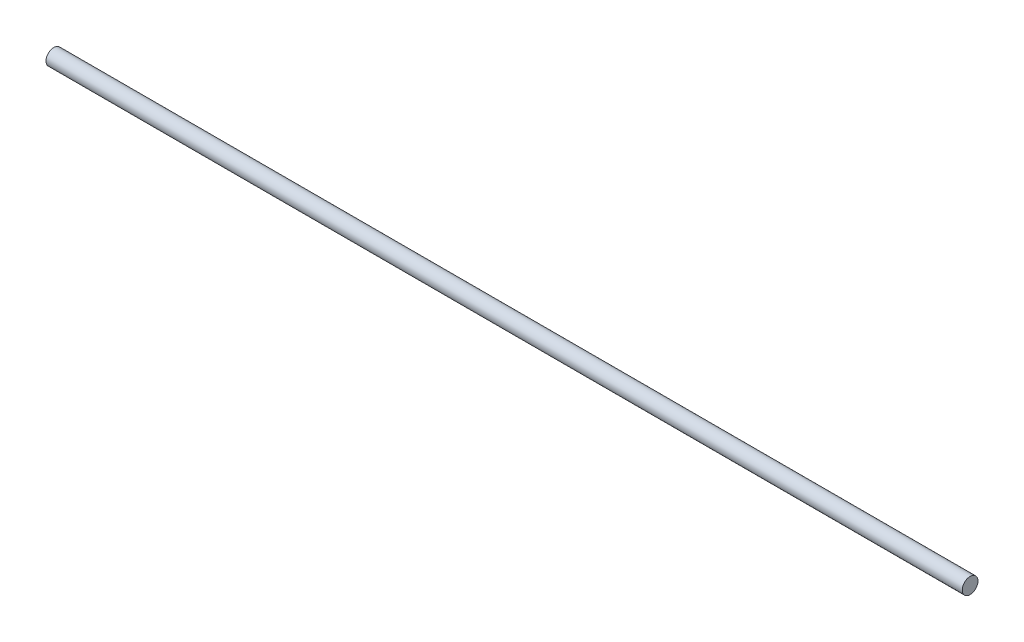
ISO-10303-21;
HEADER;
FILE_DESCRIPTION(('STEP AP214'),'2;1');
FILE_NAME('part.step','',(''),(''),'','','');
FILE_SCHEMA(('AUTOMOTIVE_DESIGN { 1 0 10303 214 1 1 1 1 }'));
ENDSEC;
DATA;
#1=APPLICATION_CONTEXT('core data for automotive mechanical design processes');
#2=APPLICATION_PROTOCOL_DEFINITION('international standard','automotive_design',2000,#1);
#3=PRODUCT_CONTEXT('',#1,'mechanical');
#4=PRODUCT('Part','Part','',(#3));
#5=PRODUCT_RELATED_PRODUCT_CATEGORY('part','',(#4));
#6=PRODUCT_DEFINITION_FORMATION('','',#4);
#7=PRODUCT_DEFINITION_CONTEXT('part definition',#1,'design');
#8=PRODUCT_DEFINITION('design','',#6,#7);
#9=PRODUCT_DEFINITION_SHAPE('','',#8);
#10=(LENGTH_UNIT() NAMED_UNIT(*) SI_UNIT(.MILLI.,.METRE.));
#11=(NAMED_UNIT(*) PLANE_ANGLE_UNIT() SI_UNIT($,.RADIAN.));
#12=(NAMED_UNIT(*) SI_UNIT($,.STERADIAN.) SOLID_ANGLE_UNIT());
#13=UNCERTAINTY_MEASURE_WITH_UNIT(LENGTH_MEASURE(1.E-05),#10,'distance_accuracy_value','');
#14=(GEOMETRIC_REPRESENTATION_CONTEXT(3) GLOBAL_UNCERTAINTY_ASSIGNED_CONTEXT((#13)) GLOBAL_UNIT_ASSIGNED_CONTEXT((#10,
#11,#12)) REPRESENTATION_CONTEXT('',''));
#15=CARTESIAN_POINT('',(0.,0.,0.));
#16=DIRECTION('',(0.,0.,1.));
#17=DIRECTION('',(1.,0.,0.));
#18=AXIS2_PLACEMENT_3D('',#15,#16,#17);
#19=CARTESIAN_POINT('',(465.,0.,0.));
#20=DIRECTION('',(-1.,0.,0.));
#21=DIRECTION('',(0.,0.,1.));
#22=AXIS2_PLACEMENT_3D('',#19,#20,#21);
#23=CYLINDRICAL_SURFACE('',#22,4.);
#24=CARTESIAN_POINT('',(465.,0.,0.));
#25=DIRECTION('',(1.,0.,0.));
#26=DIRECTION('',(0.,0.,-1.));
#27=AXIS2_PLACEMENT_3D('',#24,#25,#26);
#28=CIRCLE('',#27,4.);
#29=CARTESIAN_POINT('',(465.,0.,-4.));
#30=VERTEX_POINT('',#29);
#31=EDGE_CURVE('E10',#30,#30,#28,.T.);
#32=ORIENTED_EDGE('',*,*,#31,.F.);
#33=EDGE_LOOP('',(#32));
#34=FACE_BOUND('',#33,.T.);
#35=CARTESIAN_POINT('',(0.,0.,0.));
#36=DIRECTION('',(1.,0.,0.));
#37=DIRECTION('',(0.,0.,-1.));
#38=AXIS2_PLACEMENT_3D('',#35,#36,#37);
#39=CIRCLE('',#38,4.);
#40=CARTESIAN_POINT('',(0.,0.,-4.));
#41=VERTEX_POINT('',#40);
#42=EDGE_CURVE('E34',#41,#41,#39,.T.);
#43=ORIENTED_EDGE('',*,*,#42,.T.);
#44=EDGE_LOOP('',(#43));
#45=FACE_BOUND('',#44,.T.);
#46=ADVANCED_FACE('F31',(#34,#45),#23,.T.);
#47=CARTESIAN_POINT('',(465.,0.,0.));
#48=DIRECTION('',(1.,0.,0.));
#49=DIRECTION('',(0.,0.,-1.));
#50=AXIS2_PLACEMENT_3D('',#47,#48,#49);
#51=PLANE('',#50);
#52=ORIENTED_EDGE('',*,*,#31,.T.);
#53=EDGE_LOOP('',(#52));
#54=FACE_BOUND('',#53,.T.);
#55=ADVANCED_FACE('F46',(#54),#51,.T.);
#56=CARTESIAN_POINT('',(0.,0.,0.));
#57=DIRECTION('',(1.,0.,0.));
#58=DIRECTION('',(0.,0.,-1.));
#59=AXIS2_PLACEMENT_3D('',#56,#57,#58);
#60=PLANE('',#59);
#61=ORIENTED_EDGE('',*,*,#42,.F.);
#62=EDGE_LOOP('',(#61));
#63=FACE_BOUND('',#62,.T.);
#64=ADVANCED_FACE('F44',(#63),#60,.F.);
#65=CLOSED_SHELL('',(#46,#55,#64));
#66=MANIFOLD_SOLID_BREP('B2',#65);
#67=ADVANCED_BREP_SHAPE_REPRESENTATION('',(#18,#66),#14);
#68=SHAPE_DEFINITION_REPRESENTATION(#9,#67);
ENDSEC;
END-ISO-10303-21;
